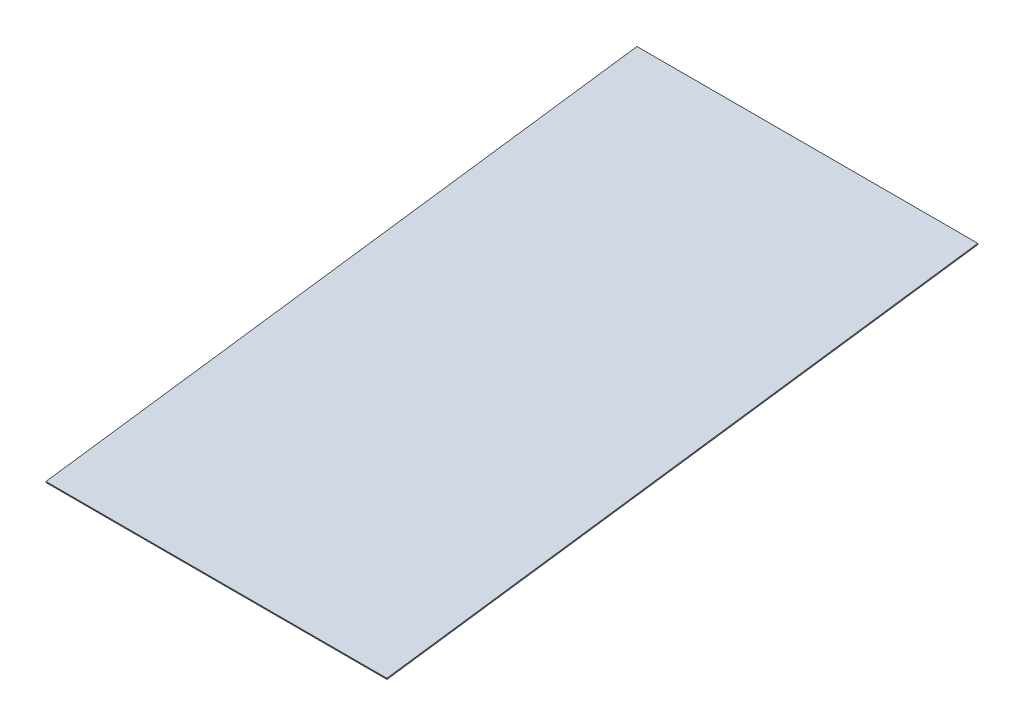
ISO-10303-21;
HEADER;
FILE_DESCRIPTION(('STEP AP214'),'2;1');
FILE_NAME('part.step','',(''),(''),'','','');
FILE_SCHEMA(('AUTOMOTIVE_DESIGN { 1 0 10303 214 1 1 1 1 }'));
ENDSEC;
DATA;
#1=APPLICATION_CONTEXT('core data for automotive mechanical design processes');
#2=APPLICATION_PROTOCOL_DEFINITION('international standard','automotive_design',2000,#1);
#3=PRODUCT_CONTEXT('',#1,'mechanical');
#4=PRODUCT('Part','Part','',(#3));
#5=PRODUCT_RELATED_PRODUCT_CATEGORY('part','',(#4));
#6=PRODUCT_DEFINITION_FORMATION('','',#4);
#7=PRODUCT_DEFINITION_CONTEXT('part definition',#1,'design');
#8=PRODUCT_DEFINITION('design','',#6,#7);
#9=PRODUCT_DEFINITION_SHAPE('','',#8);
#10=(LENGTH_UNIT() NAMED_UNIT(*) SI_UNIT(.MILLI.,.METRE.));
#11=(NAMED_UNIT(*) PLANE_ANGLE_UNIT() SI_UNIT($,.RADIAN.));
#12=(NAMED_UNIT(*) SI_UNIT($,.STERADIAN.) SOLID_ANGLE_UNIT());
#13=UNCERTAINTY_MEASURE_WITH_UNIT(LENGTH_MEASURE(1.E-05),#10,'distance_accuracy_value','');
#14=(GEOMETRIC_REPRESENTATION_CONTEXT(3) GLOBAL_UNCERTAINTY_ASSIGNED_CONTEXT((#13)) GLOBAL_UNIT_ASSIGNED_CONTEXT((#10,
#11,#12)) REPRESENTATION_CONTEXT('',''));
#15=CARTESIAN_POINT('',(0.,0.,0.));
#16=DIRECTION('',(0.,0.,1.));
#17=DIRECTION('',(1.,0.,0.));
#18=AXIS2_PLACEMENT_3D('',#15,#16,#17);
#19=CARTESIAN_POINT('',(0.,4.9676768608312,-64.8922000394604));
#20=DIRECTION('',(-1.,0.,0.));
#21=DIRECTION('',(0.,-0.136116431088056,0.99069284704587));
#22=AXIS2_PLACEMENT_3D('',#19,#20,#21);
#23=PLANE('',#22);
#24=DIRECTION('',(0.,0.99069284704587,0.136116431088056));
#25=VECTOR('',#24,1.);
#26=CARTESIAN_POINT('',(0.,4.9676768608312,-64.8922000394604));
#27=LINE('',#26,#25);
#28=CARTESIAN_POINT('',(0.,4.86860757612661,-64.9058116825692));
#29=VERTEX_POINT('',#28);
#30=CARTESIAN_POINT('',(0.,4.9676768608312,-64.8922000394604));
#31=VERTEX_POINT('',#30);
#32=EDGE_CURVE('E11',#29,#31,#27,.T.);
#33=ORIENTED_EDGE('',*,*,#32,.F.);
#34=DIRECTION('',(0.,-0.136116431088056,0.99069284704587));
#35=VECTOR('',#34,1.);
#36=CARTESIAN_POINT('',(0.,4.86860757612661,-64.9058116825692));
#37=LINE('',#36,#35);
#38=CARTESIAN_POINT('',(0.,-2.27750505599632,-12.894437212661));
#39=VERTEX_POINT('',#38);
#40=EDGE_CURVE('E88',#29,#39,#37,.T.);
#41=ORIENTED_EDGE('',*,*,#40,.T.);
#42=DIRECTION('',(0.,0.99069284704587,0.136116431088056));
#43=VECTOR('',#42,1.);
#44=CARTESIAN_POINT('',(0.,-2.17843577129173,-12.8808255695522));
#45=LINE('',#44,#43);
#46=CARTESIAN_POINT('',(0.,-2.17843577129173,-12.8808255695522));
#47=VERTEX_POINT('',#46);
#48=EDGE_CURVE('E43',#39,#47,#45,.T.);
#49=ORIENTED_EDGE('',*,*,#48,.T.);
#50=DIRECTION('',(0.,-0.136116431088056,0.99069284704587));
#51=VECTOR('',#50,1.);
#52=CARTESIAN_POINT('',(0.,4.9676768608312,-64.8922000394604));
#53=LINE('',#52,#51);
#54=EDGE_CURVE('E101',#31,#47,#53,.T.);
#55=ORIENTED_EDGE('',*,*,#54,.F.);
#56=EDGE_LOOP('',(#33,#41,#49,#55));
#57=FACE_BOUND('',#56,.T.);
#58=ADVANCED_FACE('F33',(#57),#23,.T.);
#59=CARTESIAN_POINT('',(0.,-2.17843577129173,-12.8808255695522));
#60=DIRECTION('',(0.,-0.136116431088056,0.99069284704587));
#61=DIRECTION('',(1.,0.,0.));
#62=AXIS2_PLACEMENT_3D('',#59,#60,#61);
#63=PLANE('',#62);
#64=ORIENTED_EDGE('',*,*,#48,.F.);
#65=DIRECTION('',(1.,0.,0.));
#66=VECTOR('',#65,1.);
#67=CARTESIAN_POINT('',(0.,-2.27750505599632,-12.894437212661));
#68=LINE('',#67,#66);
#69=CARTESIAN_POINT('',(30.,-2.27750505599632,-12.894437212661));
#70=VERTEX_POINT('',#69);
#71=EDGE_CURVE('E95',#39,#70,#68,.T.);
#72=ORIENTED_EDGE('',*,*,#71,.T.);
#73=DIRECTION('',(0.,0.99069284704587,0.136116431088056));
#74=VECTOR('',#73,1.);
#75=CARTESIAN_POINT('',(30.,-2.17843577129173,-12.8808255695522));
#76=LINE('',#75,#74);
#77=CARTESIAN_POINT('',(30.,-2.17843577129173,-12.8808255695522));
#78=VERTEX_POINT('',#77);
#79=EDGE_CURVE('E51',#70,#78,#76,.T.);
#80=ORIENTED_EDGE('',*,*,#79,.T.);
#81=DIRECTION('',(1.,0.,0.));
#82=VECTOR('',#81,1.);
#83=CARTESIAN_POINT('',(0.,-2.17843577129173,-12.8808255695522));
#84=LINE('',#83,#82);
#85=EDGE_CURVE('E82',#47,#78,#84,.T.);
#86=ORIENTED_EDGE('',*,*,#85,.F.);
#87=EDGE_LOOP('',(#64,#72,#80,#86));
#88=FACE_BOUND('',#87,.T.);
#89=ADVANCED_FACE('F105',(#88),#63,.T.);
#90=CARTESIAN_POINT('',(30.,4.9676768608312,-64.8922000394604));
#91=DIRECTION('',(-1.,0.,0.));
#92=DIRECTION('',(0.,-0.136116431088056,0.99069284704587));
#93=AXIS2_PLACEMENT_3D('',#90,#91,#92);
#94=PLANE('',#93);
#95=ORIENTED_EDGE('',*,*,#79,.F.);
#96=DIRECTION('',(0.,-0.136116431088056,0.99069284704587));
#97=VECTOR('',#96,1.);
#98=CARTESIAN_POINT('',(30.,4.86860757612661,-64.9058116825692));
#99=LINE('',#98,#97);
#100=CARTESIAN_POINT('',(30.,4.86860757612661,-64.9058116825692));
#101=VERTEX_POINT('',#100);
#102=EDGE_CURVE('E87',#101,#70,#99,.T.);
#103=ORIENTED_EDGE('',*,*,#102,.F.);
#104=DIRECTION('',(0.,0.99069284704587,0.136116431088056));
#105=VECTOR('',#104,1.);
#106=CARTESIAN_POINT('',(30.,4.9676768608312,-64.8922000394604));
#107=LINE('',#106,#105);
#108=CARTESIAN_POINT('',(30.,4.9676768608312,-64.8922000394604));
#109=VERTEX_POINT('',#108);
#110=EDGE_CURVE('E37',#101,#109,#107,.T.);
#111=ORIENTED_EDGE('',*,*,#110,.T.);
#112=DIRECTION('',(0.,-0.136116431088056,0.99069284704587));
#113=VECTOR('',#112,1.);
#114=CARTESIAN_POINT('',(30.,4.9676768608312,-64.8922000394604));
#115=LINE('',#114,#113);
#116=EDGE_CURVE('E97',#109,#78,#115,.T.);
#117=ORIENTED_EDGE('',*,*,#116,.T.);
#118=EDGE_LOOP('',(#95,#103,#111,#117));
#119=FACE_BOUND('',#118,.T.);
#120=ADVANCED_FACE('F90',(#119),#94,.F.);
#121=CARTESIAN_POINT('',(0.,4.9676768608312,-64.8922000394604));
#122=DIRECTION('',(0.,-0.136116431088056,0.99069284704587));
#123=DIRECTION('',(1.,0.,0.));
#124=AXIS2_PLACEMENT_3D('',#121,#122,#123);
#125=PLANE('',#124);
#126=DIRECTION('',(1.,0.,0.));
#127=VECTOR('',#126,1.);
#128=CARTESIAN_POINT('',(0.,4.86860757612661,-64.9058116825692));
#129=LINE('',#128,#127);
#130=EDGE_CURVE('E76',#29,#101,#129,.T.);
#131=ORIENTED_EDGE('',*,*,#130,.F.);
#132=ORIENTED_EDGE('',*,*,#32,.T.);
#133=DIRECTION('',(1.,0.,0.));
#134=VECTOR('',#133,1.);
#135=CARTESIAN_POINT('',(0.,4.9676768608312,-64.8922000394604));
#136=LINE('',#135,#134);
#137=EDGE_CURVE('E78',#31,#109,#136,.T.);
#138=ORIENTED_EDGE('',*,*,#137,.T.);
#139=ORIENTED_EDGE('',*,*,#110,.F.);
#140=EDGE_LOOP('',(#131,#132,#138,#139));
#141=FACE_BOUND('',#140,.T.);
#142=ADVANCED_FACE('F35',(#141),#125,.F.);
#143=CARTESIAN_POINT('',(0.,4.9676768608312,-64.8922000394604));
#144=DIRECTION('',(0.,0.99069284704587,0.136116431088056));
#145=DIRECTION('',(0.,-0.136116431088056,0.99069284704587));
#146=AXIS2_PLACEMENT_3D('',#143,#144,#145);
#147=PLANE('',#146);
#148=ORIENTED_EDGE('',*,*,#116,.F.);
#149=ORIENTED_EDGE('',*,*,#137,.F.);
#150=ORIENTED_EDGE('',*,*,#54,.T.);
#151=ORIENTED_EDGE('',*,*,#85,.T.);
#152=EDGE_LOOP('',(#148,#149,#150,#151));
#153=FACE_BOUND('',#152,.T.);
#154=ADVANCED_FACE('F104',(#153),#147,.T.);
#155=CARTESIAN_POINT('',(0.,4.86860757612661,-64.9058116825692));
#156=DIRECTION('',(0.,0.99069284704587,0.136116431088056));
#157=DIRECTION('',(0.,-0.136116431088056,0.99069284704587));
#158=AXIS2_PLACEMENT_3D('',#155,#156,#157);
#159=PLANE('',#158);
#160=ORIENTED_EDGE('',*,*,#102,.T.);
#161=ORIENTED_EDGE('',*,*,#71,.F.);
#162=ORIENTED_EDGE('',*,*,#40,.F.);
#163=ORIENTED_EDGE('',*,*,#130,.T.);
#164=EDGE_LOOP('',(#160,#161,#162,#163));
#165=FACE_BOUND('',#164,.T.);
#166=ADVANCED_FACE('F85',(#165),#159,.F.);
#167=CLOSED_SHELL('',(#58,#89,#120,#142,#154,#166));
#168=MANIFOLD_SOLID_BREP('B2',#167);
#169=ADVANCED_BREP_SHAPE_REPRESENTATION('',(#18,#168),#14);
#170=SHAPE_DEFINITION_REPRESENTATION(#9,#169);
ENDSEC;
END-ISO-10303-21;
